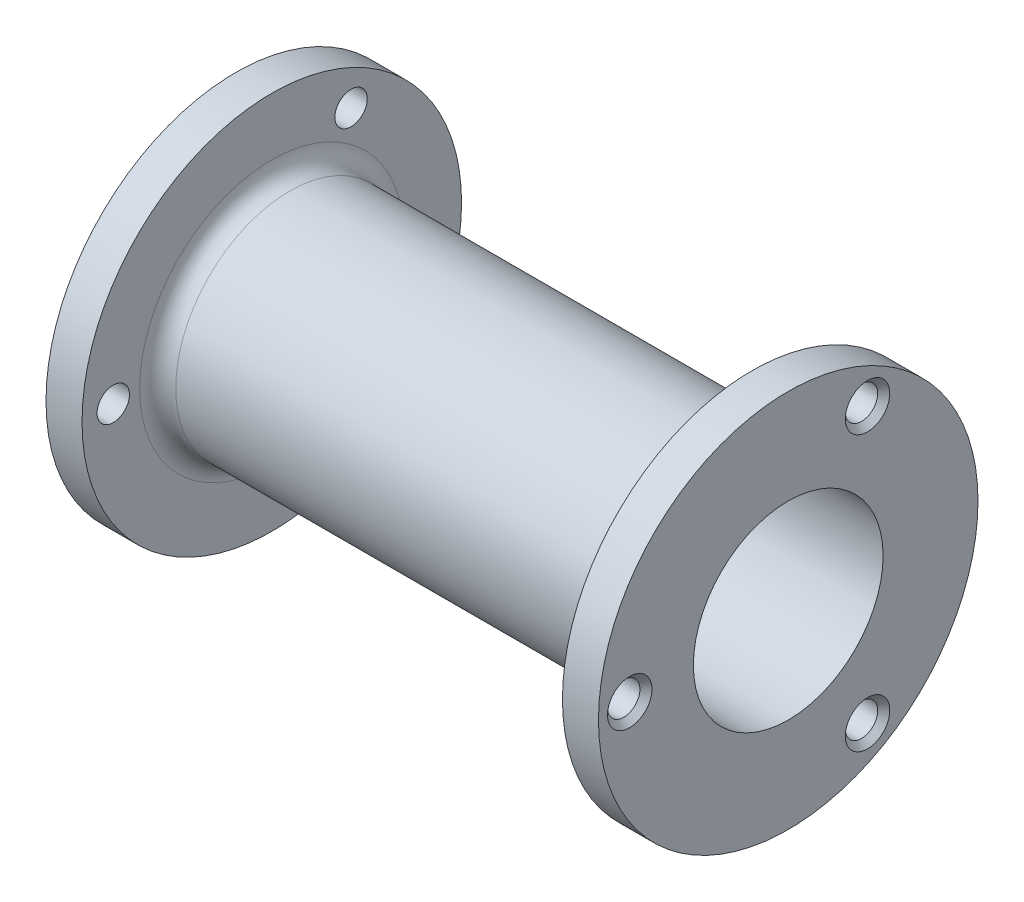
ISO-10303-21;
HEADER;
FILE_DESCRIPTION(('STEP AP214'),'2;1');
FILE_NAME('part.step','',(''),(''),'','','');
FILE_SCHEMA(('AUTOMOTIVE_DESIGN { 1 0 10303 214 1 1 1 1 }'));
ENDSEC;
DATA;
#1=APPLICATION_CONTEXT('core data for automotive mechanical design processes');
#2=APPLICATION_PROTOCOL_DEFINITION('international standard','automotive_design',2000,#1);
#3=PRODUCT_CONTEXT('',#1,'mechanical');
#4=PRODUCT('Part','Part','',(#3));
#5=PRODUCT_RELATED_PRODUCT_CATEGORY('part','',(#4));
#6=PRODUCT_DEFINITION_FORMATION('','',#4);
#7=PRODUCT_DEFINITION_CONTEXT('part definition',#1,'design');
#8=PRODUCT_DEFINITION('design','',#6,#7);
#9=PRODUCT_DEFINITION_SHAPE('','',#8);
#10=(LENGTH_UNIT() NAMED_UNIT(*) SI_UNIT(.MILLI.,.METRE.));
#11=(NAMED_UNIT(*) PLANE_ANGLE_UNIT() SI_UNIT($,.RADIAN.));
#12=(NAMED_UNIT(*) SI_UNIT($,.STERADIAN.) SOLID_ANGLE_UNIT());
#13=UNCERTAINTY_MEASURE_WITH_UNIT(LENGTH_MEASURE(1.E-05),#10,'distance_accuracy_value','');
#14=(GEOMETRIC_REPRESENTATION_CONTEXT(3) GLOBAL_UNCERTAINTY_ASSIGNED_CONTEXT((#13)) GLOBAL_UNIT_ASSIGNED_CONTEXT((#10,
#11,#12)) REPRESENTATION_CONTEXT('',''));
#15=CARTESIAN_POINT('',(0.,0.,0.));
#16=DIRECTION('',(0.,0.,1.));
#17=DIRECTION('',(1.,0.,0.));
#18=AXIS2_PLACEMENT_3D('',#15,#16,#17);
#19=CARTESIAN_POINT('',(0.,0.,0.));
#20=DIRECTION('',(1.,0.,0.));
#21=DIRECTION('',(0.,0.,-1.));
#22=AXIS2_PLACEMENT_3D('',#19,#20,#21);
#23=CYLINDRICAL_SURFACE('',#22,15.8);
#24=CARTESIAN_POINT('',(0.,0.,0.));
#25=DIRECTION('',(1.,0.,0.));
#26=DIRECTION('',(0.,0.,-1.));
#27=AXIS2_PLACEMENT_3D('',#24,#25,#26);
#28=CIRCLE('',#27,15.8);
#29=CARTESIAN_POINT('',(0.,0.,-15.8));
#30=VERTEX_POINT('',#29);
#31=EDGE_CURVE('E104',#30,#30,#28,.T.);
#32=ORIENTED_EDGE('',*,*,#31,.T.);
#33=EDGE_LOOP('',(#32));
#34=FACE_BOUND('',#33,.T.);
#35=CARTESIAN_POINT('',(3.,0.,0.));
#36=DIRECTION('',(1.,0.,0.));
#37=DIRECTION('',(0.,0.,-1.));
#38=AXIS2_PLACEMENT_3D('',#35,#36,#37);
#39=CIRCLE('',#38,15.8);
#40=CARTESIAN_POINT('',(3.,0.,-15.8));
#41=VERTEX_POINT('',#40);
#42=EDGE_CURVE('E77',#41,#41,#39,.T.);
#43=ORIENTED_EDGE('',*,*,#42,.F.);
#44=EDGE_LOOP('',(#43));
#45=FACE_BOUND('',#44,.T.);
#46=ADVANCED_FACE('F33',(#34,#45),#23,.T.);
#47=CARTESIAN_POINT('',(3.,15.8,0.));
#48=DIRECTION('',(1.,0.,0.));
#49=DIRECTION('',(0.,0.,-1.));
#50=AXIS2_PLACEMENT_3D('',#47,#48,#49);
#51=PLANE('',#50);
#52=CARTESIAN_POINT('',(3.,0.,13.2));
#53=DIRECTION('',(1.,0.,0.));
#54=DIRECTION('',(0.,0.,-1.));
#55=AXIS2_PLACEMENT_3D('',#52,#53,#54);
#56=CIRCLE('',#55,1.35);
#57=CARTESIAN_POINT('',(3.,0.,11.85));
#58=VERTEX_POINT('',#57);
#59=EDGE_CURVE('E107',#58,#58,#56,.T.);
#60=ORIENTED_EDGE('',*,*,#59,.F.);
#61=EDGE_LOOP('',(#60));
#62=FACE_BOUND('',#61,.T.);
#63=CARTESIAN_POINT('',(3.,11.4315353299546,-6.60000000000007));
#64=DIRECTION('',(1.,0.,0.));
#65=DIRECTION('',(0.,0.,-1.));
#66=AXIS2_PLACEMENT_3D('',#63,#64,#65);
#67=CIRCLE('',#66,1.35);
#68=CARTESIAN_POINT('',(3.,11.4315353299546,-7.95000000000007));
#69=VERTEX_POINT('',#68);
#70=EDGE_CURVE('E113',#69,#69,#67,.T.);
#71=ORIENTED_EDGE('',*,*,#70,.F.);
#72=EDGE_LOOP('',(#71));
#73=FACE_BOUND('',#72,.T.);
#74=CARTESIAN_POINT('',(3.,-11.4315353299547,-6.60000000000001));
#75=DIRECTION('',(1.,0.,0.));
#76=DIRECTION('',(0.,0.,-1.));
#77=AXIS2_PLACEMENT_3D('',#74,#75,#76);
#78=CIRCLE('',#77,1.35);
#79=CARTESIAN_POINT('',(3.,-11.4315353299547,-7.95000000000001));
#80=VERTEX_POINT('',#79);
#81=EDGE_CURVE('E119',#80,#80,#78,.T.);
#82=ORIENTED_EDGE('',*,*,#81,.F.);
#83=EDGE_LOOP('',(#82));
#84=FACE_BOUND('',#83,.T.);
#85=ORIENTED_EDGE('',*,*,#42,.T.);
#86=EDGE_LOOP('',(#85));
#87=FACE_BOUND('',#86,.T.);
#88=CARTESIAN_POINT('',(3.,0.,0.));
#89=DIRECTION('',(1.,0.,0.));
#90=DIRECTION('',(0.,0.,-1.));
#91=AXIS2_PLACEMENT_3D('',#88,#89,#90);
#92=CIRCLE('',#91,11.);
#93=CARTESIAN_POINT('',(3.,0.,-11.));
#94=VERTEX_POINT('',#93);
#95=EDGE_CURVE('E80',#94,#94,#92,.T.);
#96=ORIENTED_EDGE('',*,*,#95,.F.);
#97=EDGE_LOOP('',(#96));
#98=FACE_BOUND('',#97,.T.);
#99=ADVANCED_FACE('F167',(#62,#73,#84,#87,#98),#51,.T.);
#100=CARTESIAN_POINT('',(4.5,0.,0.));
#101=DIRECTION('',(1.,0.,0.));
#102=DIRECTION('',(0.,0.,-1.));
#103=AXIS2_PLACEMENT_3D('',#100,#101,#102);
#104=TOROIDAL_SURFACE('',#103,11.,1.5);
#105=ORIENTED_EDGE('',*,*,#95,.T.);
#106=EDGE_LOOP('',(#105));
#107=FACE_BOUND('',#106,.T.);
#108=CARTESIAN_POINT('',(4.5,0.,0.));
#109=DIRECTION('',(1.,0.,0.));
#110=DIRECTION('',(0.,0.,-1.));
#111=AXIS2_PLACEMENT_3D('',#108,#109,#110);
#112=CIRCLE('',#111,9.5);
#113=CARTESIAN_POINT('',(4.5,0.,-9.5));
#114=VERTEX_POINT('',#113);
#115=EDGE_CURVE('E83',#114,#114,#112,.T.);
#116=ORIENTED_EDGE('',*,*,#115,.F.);
#117=EDGE_LOOP('',(#116));
#118=FACE_BOUND('',#117,.T.);
#119=ADVANCED_FACE('F173',(#107,#118),#104,.F.);
#120=CARTESIAN_POINT('',(0.,0.,0.));
#121=DIRECTION('',(1.,0.,0.));
#122=DIRECTION('',(0.,0.,-1.));
#123=AXIS2_PLACEMENT_3D('',#120,#121,#122);
#124=CYLINDRICAL_SURFACE('',#123,9.5);
#125=ORIENTED_EDGE('',*,*,#115,.T.);
#126=EDGE_LOOP('',(#125));
#127=FACE_BOUND('',#126,.T.);
#128=CARTESIAN_POINT('',(41.5,0.,0.));
#129=DIRECTION('',(1.,0.,0.));
#130=DIRECTION('',(0.,0.,-1.));
#131=AXIS2_PLACEMENT_3D('',#128,#129,#130);
#132=CIRCLE('',#131,9.5);
#133=CARTESIAN_POINT('',(41.5,0.,-9.5));
#134=VERTEX_POINT('',#133);
#135=EDGE_CURVE('E86',#134,#134,#132,.T.);
#136=ORIENTED_EDGE('',*,*,#135,.F.);
#137=EDGE_LOOP('',(#136));
#138=FACE_BOUND('',#137,.T.);
#139=ADVANCED_FACE('F180',(#127,#138),#124,.T.);
#140=CARTESIAN_POINT('',(41.5,0.,0.));
#141=DIRECTION('',(1.,0.,0.));
#142=DIRECTION('',(0.,0.,-1.));
#143=AXIS2_PLACEMENT_3D('',#140,#141,#142);
#144=TOROIDAL_SURFACE('',#143,11.,1.5);
#145=ORIENTED_EDGE('',*,*,#135,.T.);
#146=EDGE_LOOP('',(#145));
#147=FACE_BOUND('',#146,.T.);
#148=CARTESIAN_POINT('',(43.,0.,0.));
#149=DIRECTION('',(1.,0.,0.));
#150=DIRECTION('',(0.,0.,-1.));
#151=AXIS2_PLACEMENT_3D('',#148,#149,#150);
#152=CIRCLE('',#151,11.);
#153=CARTESIAN_POINT('',(43.,0.,-11.));
#154=VERTEX_POINT('',#153);
#155=EDGE_CURVE('E89',#154,#154,#152,.T.);
#156=ORIENTED_EDGE('',*,*,#155,.F.);
#157=EDGE_LOOP('',(#156));
#158=FACE_BOUND('',#157,.T.);
#159=ADVANCED_FACE('F132',(#147,#158),#144,.F.);
#160=CARTESIAN_POINT('',(43.,11.,0.));
#161=DIRECTION('',(-1.,0.,0.));
#162=DIRECTION('',(0.,0.,1.));
#163=AXIS2_PLACEMENT_3D('',#160,#161,#162);
#164=PLANE('',#163);
#165=CARTESIAN_POINT('',(43.,0.,13.2));
#166=DIRECTION('',(-1.,0.,0.));
#167=DIRECTION('',(0.,0.,1.));
#168=AXIS2_PLACEMENT_3D('',#165,#166,#167);
#169=CIRCLE('',#168,1.35);
#170=CARTESIAN_POINT('',(43.,0.,14.55));
#171=VERTEX_POINT('',#170);
#172=EDGE_CURVE('E110',#171,#171,#169,.T.);
#173=ORIENTED_EDGE('',*,*,#172,.F.);
#174=EDGE_LOOP('',(#173));
#175=FACE_BOUND('',#174,.T.);
#176=CARTESIAN_POINT('',(43.,11.4315353299546,-6.60000000000007));
#177=DIRECTION('',(-1.,0.,0.));
#178=DIRECTION('',(0.,0.,1.));
#179=AXIS2_PLACEMENT_3D('',#176,#177,#178);
#180=CIRCLE('',#179,1.35);
#181=CARTESIAN_POINT('',(43.,11.4315353299546,-5.25000000000007));
#182=VERTEX_POINT('',#181);
#183=EDGE_CURVE('E116',#182,#182,#180,.T.);
#184=ORIENTED_EDGE('',*,*,#183,.F.);
#185=EDGE_LOOP('',(#184));
#186=FACE_BOUND('',#185,.T.);
#187=CARTESIAN_POINT('',(43.,-11.4315353299547,-6.60000000000001));
#188=DIRECTION('',(-1.,0.,0.));
#189=DIRECTION('',(0.,0.,1.));
#190=AXIS2_PLACEMENT_3D('',#187,#188,#189);
#191=CIRCLE('',#190,1.35);
#192=CARTESIAN_POINT('',(43.,-11.4315353299547,-5.25000000000002));
#193=VERTEX_POINT('',#192);
#194=EDGE_CURVE('E122',#193,#193,#191,.T.);
#195=ORIENTED_EDGE('',*,*,#194,.F.);
#196=EDGE_LOOP('',(#195));
#197=FACE_BOUND('',#196,.T.);
#198=ORIENTED_EDGE('',*,*,#155,.T.);
#199=EDGE_LOOP('',(#198));
#200=FACE_BOUND('',#199,.T.);
#201=CARTESIAN_POINT('',(43.,0.,0.));
#202=DIRECTION('',(1.,0.,0.));
#203=DIRECTION('',(0.,0.,-1.));
#204=AXIS2_PLACEMENT_3D('',#201,#202,#203);
#205=CIRCLE('',#204,15.8);
#206=CARTESIAN_POINT('',(43.,0.,-15.8));
#207=VERTEX_POINT('',#206);
#208=EDGE_CURVE('E92',#207,#207,#205,.T.);
#209=ORIENTED_EDGE('',*,*,#208,.F.);
#210=EDGE_LOOP('',(#209));
#211=FACE_BOUND('',#210,.T.);
#212=ADVANCED_FACE('F128',(#175,#186,#197,#200,#211),#164,.T.);
#213=CARTESIAN_POINT('',(0.,0.,0.));
#214=DIRECTION('',(1.,0.,0.));
#215=DIRECTION('',(0.,0.,-1.));
#216=AXIS2_PLACEMENT_3D('',#213,#214,#215);
#217=CYLINDRICAL_SURFACE('',#216,15.8);
#218=ORIENTED_EDGE('',*,*,#208,.T.);
#219=EDGE_LOOP('',(#218));
#220=FACE_BOUND('',#219,.T.);
#221=CARTESIAN_POINT('',(46.,0.,0.));
#222=DIRECTION('',(1.,0.,0.));
#223=DIRECTION('',(0.,0.,-1.));
#224=AXIS2_PLACEMENT_3D('',#221,#222,#223);
#225=CIRCLE('',#224,15.8);
#226=CARTESIAN_POINT('',(46.,0.,-15.8));
#227=VERTEX_POINT('',#226);
#228=EDGE_CURVE('E95',#227,#227,#225,.T.);
#229=ORIENTED_EDGE('',*,*,#228,.F.);
#230=EDGE_LOOP('',(#229));
#231=FACE_BOUND('',#230,.T.);
#232=ADVANCED_FACE('F131',(#220,#231),#217,.T.);
#233=CARTESIAN_POINT('',(46.,15.8,0.));
#234=DIRECTION('',(1.,0.,0.));
#235=DIRECTION('',(0.,0.,-1.));
#236=AXIS2_PLACEMENT_3D('',#233,#234,#235);
#237=PLANE('',#236);
#238=CARTESIAN_POINT('',(46.,0.,13.2));
#239=DIRECTION('',(1.,0.,0.));
#240=DIRECTION('',(0.,0.,-1.));
#241=AXIS2_PLACEMENT_3D('',#238,#239,#240);
#242=CIRCLE('',#241,1.85000000000001);
#243=CARTESIAN_POINT('',(46.,0.,11.35));
#244=VERTEX_POINT('',#243);
#245=EDGE_CURVE('E44',#244,#244,#242,.F.);
#246=ORIENTED_EDGE('',*,*,#245,.T.);
#247=EDGE_LOOP('',(#246));
#248=FACE_BOUND('',#247,.T.);
#249=CARTESIAN_POINT('',(46.,-11.4315353299547,-6.60000000000001));
#250=DIRECTION('',(1.,0.,0.));
#251=DIRECTION('',(0.,0.,-1.));
#252=AXIS2_PLACEMENT_3D('',#249,#250,#251);
#253=CIRCLE('',#252,1.85);
#254=CARTESIAN_POINT('',(46.,-11.4315353299547,-8.45000000000002));
#255=VERTEX_POINT('',#254);
#256=EDGE_CURVE('E48',#255,#255,#253,.F.);
#257=ORIENTED_EDGE('',*,*,#256,.T.);
#258=EDGE_LOOP('',(#257));
#259=FACE_BOUND('',#258,.T.);
#260=CARTESIAN_POINT('',(46.,11.4315353299546,-6.60000000000007));
#261=DIRECTION('',(1.,0.,0.));
#262=DIRECTION('',(0.,0.,-1.));
#263=AXIS2_PLACEMENT_3D('',#260,#261,#262);
#264=CIRCLE('',#263,1.85);
#265=CARTESIAN_POINT('',(46.,11.4315353299546,-8.45000000000007));
#266=VERTEX_POINT('',#265);
#267=EDGE_CURVE('E53',#266,#266,#264,.F.);
#268=ORIENTED_EDGE('',*,*,#267,.T.);
#269=EDGE_LOOP('',(#268));
#270=FACE_BOUND('',#269,.T.);
#271=ORIENTED_EDGE('',*,*,#228,.T.);
#272=EDGE_LOOP('',(#271));
#273=FACE_BOUND('',#272,.T.);
#274=CARTESIAN_POINT('',(46.,0.,0.));
#275=DIRECTION('',(1.,0.,0.));
#276=DIRECTION('',(0.,0.,-1.));
#277=AXIS2_PLACEMENT_3D('',#274,#275,#276);
#278=CIRCLE('',#277,7.9);
#279=CARTESIAN_POINT('',(46.,0.,-7.9));
#280=VERTEX_POINT('',#279);
#281=EDGE_CURVE('E98',#280,#280,#278,.T.);
#282=ORIENTED_EDGE('',*,*,#281,.F.);
#283=EDGE_LOOP('',(#282));
#284=FACE_BOUND('',#283,.T.);
#285=ADVANCED_FACE('F141',(#248,#259,#270,#273,#284),#237,.T.);
#286=CARTESIAN_POINT('',(0.,0.,0.));
#287=DIRECTION('',(1.,0.,0.));
#288=DIRECTION('',(0.,0.,-1.));
#289=AXIS2_PLACEMENT_3D('',#286,#287,#288);
#290=CYLINDRICAL_SURFACE('',#289,7.9);
#291=ORIENTED_EDGE('',*,*,#281,.T.);
#292=EDGE_LOOP('',(#291));
#293=FACE_BOUND('',#292,.T.);
#294=CARTESIAN_POINT('',(0.,0.,0.));
#295=DIRECTION('',(1.,0.,0.));
#296=DIRECTION('',(0.,0.,-1.));
#297=AXIS2_PLACEMENT_3D('',#294,#295,#296);
#298=CIRCLE('',#297,7.9);
#299=CARTESIAN_POINT('',(0.,0.,-7.9));
#300=VERTEX_POINT('',#299);
#301=EDGE_CURVE('E101',#300,#300,#298,.T.);
#302=ORIENTED_EDGE('',*,*,#301,.F.);
#303=EDGE_LOOP('',(#302));
#304=FACE_BOUND('',#303,.T.);
#305=ADVANCED_FACE('F147',(#293,#304),#290,.F.);
#306=CARTESIAN_POINT('',(0.,7.9,0.));
#307=DIRECTION('',(-1.,0.,0.));
#308=DIRECTION('',(0.,0.,1.));
#309=AXIS2_PLACEMENT_3D('',#306,#307,#308);
#310=PLANE('',#309);
#311=CARTESIAN_POINT('',(0.,-11.4315353299547,-6.60000000000001));
#312=DIRECTION('',(-1.,0.,0.));
#313=DIRECTION('',(0.,0.,1.));
#314=AXIS2_PLACEMENT_3D('',#311,#312,#313);
#315=CIRCLE('',#314,1.84999999999999);
#316=CARTESIAN_POINT('',(0.,-11.4315353299547,-4.75000000000002));
#317=VERTEX_POINT('',#316);
#318=EDGE_CURVE('E68',#317,#317,#315,.F.);
#319=ORIENTED_EDGE('',*,*,#318,.T.);
#320=EDGE_LOOP('',(#319));
#321=FACE_BOUND('',#320,.T.);
#322=CARTESIAN_POINT('',(0.,11.4315353299546,-6.60000000000007));
#323=DIRECTION('',(-1.,0.,0.));
#324=DIRECTION('',(0.,0.,1.));
#325=AXIS2_PLACEMENT_3D('',#322,#323,#324);
#326=CIRCLE('',#325,1.84999999999999);
#327=CARTESIAN_POINT('',(0.,11.4315353299546,-4.75000000000008));
#328=VERTEX_POINT('',#327);
#329=EDGE_CURVE('E71',#328,#328,#326,.F.);
#330=ORIENTED_EDGE('',*,*,#329,.T.);
#331=EDGE_LOOP('',(#330));
#332=FACE_BOUND('',#331,.T.);
#333=CARTESIAN_POINT('',(0.,0.,13.2));
#334=DIRECTION('',(-1.,0.,0.));
#335=DIRECTION('',(0.,0.,1.));
#336=AXIS2_PLACEMENT_3D('',#333,#334,#335);
#337=CIRCLE('',#336,1.85);
#338=CARTESIAN_POINT('',(0.,0.,15.05));
#339=VERTEX_POINT('',#338);
#340=EDGE_CURVE('E74',#339,#339,#337,.F.);
#341=ORIENTED_EDGE('',*,*,#340,.T.);
#342=EDGE_LOOP('',(#341));
#343=FACE_BOUND('',#342,.T.);
#344=ORIENTED_EDGE('',*,*,#301,.T.);
#345=EDGE_LOOP('',(#344));
#346=FACE_BOUND('',#345,.T.);
#347=ORIENTED_EDGE('',*,*,#31,.F.);
#348=EDGE_LOOP('',(#347));
#349=FACE_BOUND('',#348,.T.);
#350=ADVANCED_FACE('F154',(#321,#332,#343,#346,#349),#310,.T.);
#351=CARTESIAN_POINT('',(0.,-11.4315353299547,-6.60000000000001));
#352=DIRECTION('',(1.,0.,0.));
#353=DIRECTION('',(0.,0.,-1.));
#354=AXIS2_PLACEMENT_3D('',#351,#352,#353);
#355=CYLINDRICAL_SURFACE('',#354,1.35);
#356=CARTESIAN_POINT('',(0.499999999999986,-11.4315353299547,-6.60000000000001));
#357=DIRECTION('',(-1.,0.,0.));
#358=DIRECTION('',(0.,0.,1.));
#359=AXIS2_PLACEMENT_3D('',#356,#357,#358);
#360=CIRCLE('',#359,1.35);
#361=CARTESIAN_POINT('',(0.499999999999986,-11.4315353299547,-5.25000000000002));
#362=VERTEX_POINT('',#361);
#363=EDGE_CURVE('E65',#362,#362,#360,.T.);
#364=ORIENTED_EDGE('',*,*,#363,.T.);
#365=EDGE_LOOP('',(#364));
#366=FACE_BOUND('',#365,.T.);
#367=ORIENTED_EDGE('',*,*,#81,.T.);
#368=EDGE_LOOP('',(#367));
#369=FACE_BOUND('',#368,.T.);
#370=ADVANCED_FACE('F160',(#366,#369),#355,.F.);
#371=CARTESIAN_POINT('',(0.,11.4315353299546,-6.60000000000007));
#372=DIRECTION('',(1.,0.,0.));
#373=DIRECTION('',(0.,0.,-1.));
#374=AXIS2_PLACEMENT_3D('',#371,#372,#373);
#375=CYLINDRICAL_SURFACE('',#374,1.35);
#376=CARTESIAN_POINT('',(0.499999999999986,11.4315353299546,-6.60000000000007));
#377=DIRECTION('',(-1.,0.,0.));
#378=DIRECTION('',(0.,0.,1.));
#379=AXIS2_PLACEMENT_3D('',#376,#377,#378);
#380=CIRCLE('',#379,1.35);
#381=CARTESIAN_POINT('',(0.499999999999986,11.4315353299546,-5.25000000000007));
#382=VERTEX_POINT('',#381);
#383=EDGE_CURVE('E62',#382,#382,#380,.T.);
#384=ORIENTED_EDGE('',*,*,#383,.T.);
#385=EDGE_LOOP('',(#384));
#386=FACE_BOUND('',#385,.T.);
#387=ORIENTED_EDGE('',*,*,#70,.T.);
#388=EDGE_LOOP('',(#387));
#389=FACE_BOUND('',#388,.T.);
#390=ADVANCED_FACE('F275',(#386,#389),#375,.F.);
#391=CARTESIAN_POINT('',(0.,0.,13.2));
#392=DIRECTION('',(1.,0.,0.));
#393=DIRECTION('',(0.,0.,-1.));
#394=AXIS2_PLACEMENT_3D('',#391,#392,#393);
#395=CYLINDRICAL_SURFACE('',#394,1.35);
#396=CARTESIAN_POINT('',(0.499999999999992,0.,13.2));
#397=DIRECTION('',(-1.,0.,0.));
#398=DIRECTION('',(0.,0.,1.));
#399=AXIS2_PLACEMENT_3D('',#396,#397,#398);
#400=CIRCLE('',#399,1.35);
#401=CARTESIAN_POINT('',(0.499999999999992,0.,14.55));
#402=VERTEX_POINT('',#401);
#403=EDGE_CURVE('E59',#402,#402,#400,.T.);
#404=ORIENTED_EDGE('',*,*,#403,.T.);
#405=EDGE_LOOP('',(#404));
#406=FACE_BOUND('',#405,.T.);
#407=ORIENTED_EDGE('',*,*,#59,.T.);
#408=EDGE_LOOP('',(#407));
#409=FACE_BOUND('',#408,.T.);
#410=ADVANCED_FACE('F266',(#406,#409),#395,.F.);
#411=CARTESIAN_POINT('',(45.5,-11.4315353299547,-6.60000000000001));
#412=DIRECTION('',(1.,0.,0.));
#413=DIRECTION('',(0.,0.,-1.));
#414=AXIS2_PLACEMENT_3D('',#411,#412,#413);
#415=CIRCLE('',#414,1.35);
#416=CARTESIAN_POINT('',(45.5,-11.4315353299547,-7.95000000000001));
#417=VERTEX_POINT('',#416);
#418=EDGE_CURVE('E40',#417,#417,#415,.T.);
#419=ORIENTED_EDGE('',*,*,#418,.T.);
#420=EDGE_LOOP('',(#419));
#421=FACE_BOUND('',#420,.T.);
#422=ORIENTED_EDGE('',*,*,#194,.T.);
#423=EDGE_LOOP('',(#422));
#424=FACE_BOUND('',#423,.T.);
#425=ADVANCED_FACE('F126',(#421,#424),#355,.F.);
#426=CARTESIAN_POINT('',(45.5,11.4315353299546,-6.60000000000007));
#427=DIRECTION('',(1.,0.,0.));
#428=DIRECTION('',(0.,0.,-1.));
#429=AXIS2_PLACEMENT_3D('',#426,#427,#428);
#430=CIRCLE('',#429,1.35);
#431=CARTESIAN_POINT('',(45.5,11.4315353299546,-7.95000000000007));
#432=VERTEX_POINT('',#431);
#433=EDGE_CURVE('E10',#432,#432,#430,.T.);
#434=ORIENTED_EDGE('',*,*,#433,.T.);
#435=EDGE_LOOP('',(#434));
#436=FACE_BOUND('',#435,.T.);
#437=ORIENTED_EDGE('',*,*,#183,.T.);
#438=EDGE_LOOP('',(#437));
#439=FACE_BOUND('',#438,.T.);
#440=ADVANCED_FACE('F263',(#436,#439),#375,.F.);
#441=CARTESIAN_POINT('',(45.5,0.,13.2));
#442=DIRECTION('',(1.,0.,0.));
#443=DIRECTION('',(0.,0.,-1.));
#444=AXIS2_PLACEMENT_3D('',#441,#442,#443);
#445=CIRCLE('',#444,1.35);
#446=CARTESIAN_POINT('',(45.5,0.,11.85));
#447=VERTEX_POINT('',#446);
#448=EDGE_CURVE('E56',#447,#447,#445,.T.);
#449=ORIENTED_EDGE('',*,*,#448,.T.);
#450=EDGE_LOOP('',(#449));
#451=FACE_BOUND('',#450,.T.);
#452=ORIENTED_EDGE('',*,*,#172,.T.);
#453=EDGE_LOOP('',(#452));
#454=FACE_BOUND('',#453,.T.);
#455=ADVANCED_FACE('F199',(#451,#454),#395,.F.);
#456=CARTESIAN_POINT('',(0.,-11.4315353299547,-6.60000000000001));
#457=DIRECTION('',(-1.,0.,0.));
#458=DIRECTION('',(0.,0.,1.));
#459=AXIS2_PLACEMENT_3D('',#456,#457,#458);
#460=CONICAL_SURFACE('',#459,1.84999999999999,0.785398163397453);
#461=ORIENTED_EDGE('',*,*,#363,.F.);
#462=EDGE_LOOP('',(#461));
#463=FACE_BOUND('',#462,.T.);
#464=ORIENTED_EDGE('',*,*,#318,.F.);
#465=EDGE_LOOP('',(#464));
#466=FACE_BOUND('',#465,.T.);
#467=ADVANCED_FACE('F195',(#463,#466),#460,.F.);
#468=CARTESIAN_POINT('',(0.,11.4315353299546,-6.60000000000007));
#469=DIRECTION('',(-1.,0.,0.));
#470=DIRECTION('',(0.,0.,1.));
#471=AXIS2_PLACEMENT_3D('',#468,#469,#470);
#472=CONICAL_SURFACE('',#471,1.84999999999999,0.785398163397453);
#473=ORIENTED_EDGE('',*,*,#383,.F.);
#474=EDGE_LOOP('',(#473));
#475=FACE_BOUND('',#474,.T.);
#476=ORIENTED_EDGE('',*,*,#329,.F.);
#477=EDGE_LOOP('',(#476));
#478=FACE_BOUND('',#477,.T.);
#479=ADVANCED_FACE('F198',(#475,#478),#472,.F.);
#480=CARTESIAN_POINT('',(0.,0.,13.2));
#481=DIRECTION('',(-1.,0.,0.));
#482=DIRECTION('',(0.,0.,1.));
#483=AXIS2_PLACEMENT_3D('',#480,#481,#482);
#484=CONICAL_SURFACE('',#483,1.85,0.785398163397453);
#485=ORIENTED_EDGE('',*,*,#403,.F.);
#486=EDGE_LOOP('',(#485));
#487=FACE_BOUND('',#486,.T.);
#488=ORIENTED_EDGE('',*,*,#340,.F.);
#489=EDGE_LOOP('',(#488));
#490=FACE_BOUND('',#489,.T.);
#491=ADVANCED_FACE('F203',(#487,#490),#484,.F.);
#492=CARTESIAN_POINT('',(45.5,0.,13.2));
#493=DIRECTION('',(1.,0.,0.));
#494=DIRECTION('',(0.,0.,-1.));
#495=AXIS2_PLACEMENT_3D('',#492,#493,#494);
#496=CONICAL_SURFACE('',#495,1.35,0.785398163397452);
#497=ORIENTED_EDGE('',*,*,#245,.F.);
#498=EDGE_LOOP('',(#497));
#499=FACE_BOUND('',#498,.T.);
#500=ORIENTED_EDGE('',*,*,#448,.F.);
#501=EDGE_LOOP('',(#500));
#502=FACE_BOUND('',#501,.T.);
#503=ADVANCED_FACE('F207',(#499,#502),#496,.F.);
#504=CARTESIAN_POINT('',(45.5,-11.4315353299547,-6.60000000000001));
#505=DIRECTION('',(1.,0.,0.));
#506=DIRECTION('',(0.,0.,-1.));
#507=AXIS2_PLACEMENT_3D('',#504,#505,#506);
#508=CONICAL_SURFACE('',#507,1.35,0.785398163397453);
#509=ORIENTED_EDGE('',*,*,#256,.F.);
#510=EDGE_LOOP('',(#509));
#511=FACE_BOUND('',#510,.T.);
#512=ORIENTED_EDGE('',*,*,#418,.F.);
#513=EDGE_LOOP('',(#512));
#514=FACE_BOUND('',#513,.T.);
#515=ADVANCED_FACE('F210',(#511,#514),#508,.F.);
#516=CARTESIAN_POINT('',(45.5,11.4315353299546,-6.60000000000007));
#517=DIRECTION('',(1.,0.,0.));
#518=DIRECTION('',(0.,0.,-1.));
#519=AXIS2_PLACEMENT_3D('',#516,#517,#518);
#520=CONICAL_SURFACE('',#519,1.35,0.785398163397453);
#521=ORIENTED_EDGE('',*,*,#267,.F.);
#522=EDGE_LOOP('',(#521));
#523=FACE_BOUND('',#522,.T.);
#524=ORIENTED_EDGE('',*,*,#433,.F.);
#525=EDGE_LOOP('',(#524));
#526=FACE_BOUND('',#525,.T.);
#527=ADVANCED_FACE('F35',(#523,#526),#520,.F.);
#528=CLOSED_SHELL('',(#46,#99,#119,#139,#159,#212,#232,#285,#305,#350,#370,#390,#410,#425,#440,
#455,#467,#479,#491,#503,#515,#527));
#529=MANIFOLD_SOLID_BREP('B2',#528);
#530=ADVANCED_BREP_SHAPE_REPRESENTATION('',(#18,#529),#14);
#531=SHAPE_DEFINITION_REPRESENTATION(#9,#530);
ENDSEC;
END-ISO-10303-21;
